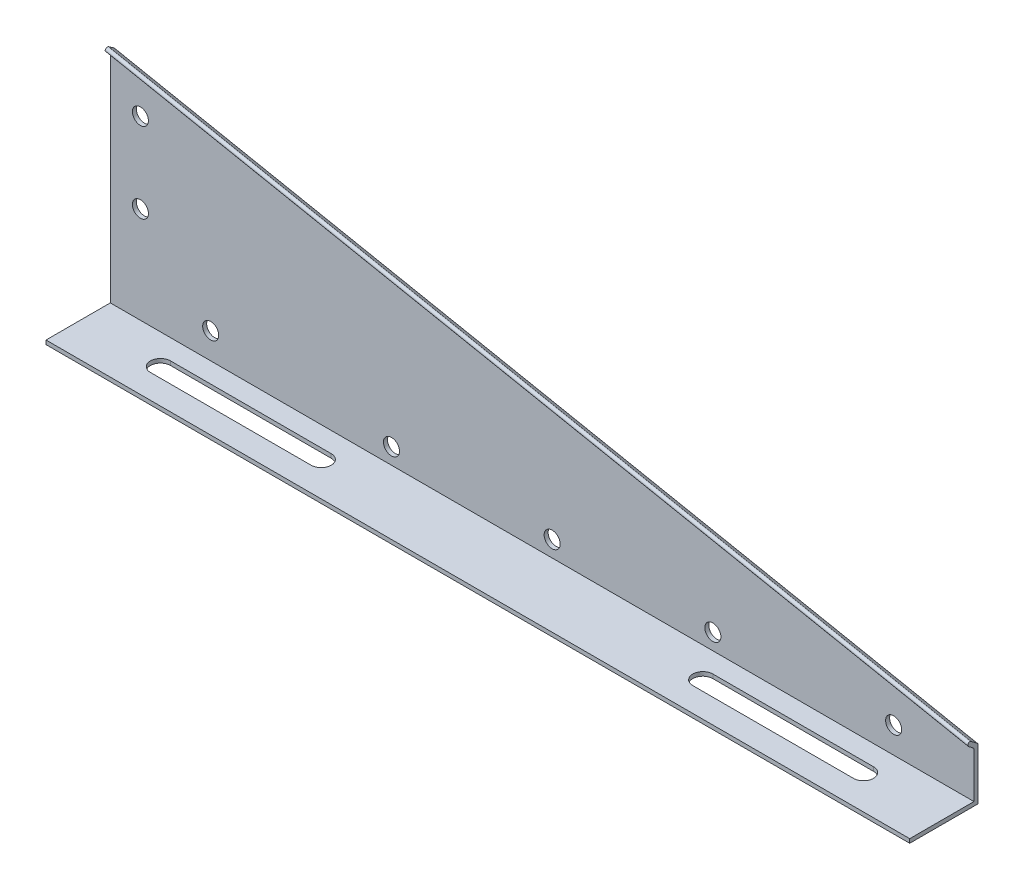
ISO-10303-21;
HEADER;
FILE_DESCRIPTION(('STEP AP214'),'2;1');
FILE_NAME('part.step','',(''),(''),'','','');
FILE_SCHEMA(('AUTOMOTIVE_DESIGN { 1 0 10303 214 1 1 1 1 }'));
ENDSEC;
DATA;
#1=APPLICATION_CONTEXT('core data for automotive mechanical design processes');
#2=APPLICATION_PROTOCOL_DEFINITION('international standard','automotive_design',2000,#1);
#3=PRODUCT_CONTEXT('',#1,'mechanical');
#4=PRODUCT('Part','Part','',(#3));
#5=PRODUCT_RELATED_PRODUCT_CATEGORY('part','',(#4));
#6=PRODUCT_DEFINITION_FORMATION('','',#4);
#7=PRODUCT_DEFINITION_CONTEXT('part definition',#1,'design');
#8=PRODUCT_DEFINITION('design','',#6,#7);
#9=PRODUCT_DEFINITION_SHAPE('','',#8);
#10=(LENGTH_UNIT() NAMED_UNIT(*) SI_UNIT(.MILLI.,.METRE.));
#11=(NAMED_UNIT(*) PLANE_ANGLE_UNIT() SI_UNIT($,.RADIAN.));
#12=(NAMED_UNIT(*) SI_UNIT($,.STERADIAN.) SOLID_ANGLE_UNIT());
#13=UNCERTAINTY_MEASURE_WITH_UNIT(LENGTH_MEASURE(1.E-05),#10,'distance_accuracy_value','');
#14=(GEOMETRIC_REPRESENTATION_CONTEXT(3) GLOBAL_UNCERTAINTY_ASSIGNED_CONTEXT((#13)) GLOBAL_UNIT_ASSIGNED_CONTEXT((#10,
#11,#12)) REPRESENTATION_CONTEXT('',''));
#15=CARTESIAN_POINT('',(0.,0.,0.));
#16=DIRECTION('',(0.,0.,1.));
#17=DIRECTION('',(1.,0.,0.));
#18=AXIS2_PLACEMENT_3D('',#15,#16,#17);
#19=CARTESIAN_POINT('',(0.,110.,2.));
#20=DIRECTION('',(1.,0.,0.));
#21=DIRECTION('',(0.,1.,0.));
#22=AXIS2_PLACEMENT_3D('',#19,#20,#21);
#23=PLANE('',#22);
#24=DIRECTION('',(0.,-1.,0.));
#25=VECTOR('',#24,1.);
#26=CARTESIAN_POINT('',(0.,110.,2.));
#27=LINE('',#26,#25);
#28=CARTESIAN_POINT('',(0.,2.,2.));
#29=VERTEX_POINT('',#28);
#30=CARTESIAN_POINT('',(0.,0.,2.));
#31=VERTEX_POINT('',#30);
#32=EDGE_CURVE('E187',#29,#31,#27,.T.);
#33=ORIENTED_EDGE('',*,*,#32,.F.);
#34=DIRECTION('',(0.,0.,1.));
#35=VECTOR('',#34,1.);
#36=CARTESIAN_POINT('',(0.,2.,-30.));
#37=LINE('',#36,#35);
#38=CARTESIAN_POINT('',(0.,2.,-30.));
#39=VERTEX_POINT('',#38);
#40=EDGE_CURVE('E49',#39,#29,#37,.T.);
#41=ORIENTED_EDGE('',*,*,#40,.F.);
#42=DIRECTION('',(0.,-1.,0.));
#43=VECTOR('',#42,1.);
#44=CARTESIAN_POINT('',(0.,110.,-30.));
#45=LINE('',#44,#43);
#46=CARTESIAN_POINT('',(0.,109.490324815257,-30.));
#47=VERTEX_POINT('',#46);
#48=EDGE_CURVE('E220',#47,#39,#45,.T.);
#49=ORIENTED_EDGE('',*,*,#48,.F.);
#50=CARTESIAN_POINT('',(0.,109.490324815257,-29.));
#51=DIRECTION('',(1.,0.,0.));
#52=DIRECTION('',(0.,1.,0.));
#53=AXIS2_PLACEMENT_3D('',#50,#51,#52);
#54=ELLIPSE('',#53,1.01935036948573,1.);
#55=CARTESIAN_POINT('',(0.,110.,-29.8660254037845));
#56=VERTEX_POINT('',#55);
#57=EDGE_CURVE('E206',#47,#56,#54,.T.);
#58=ORIENTED_EDGE('',*,*,#57,.T.);
#59=DIRECTION('',(0.,0.,1.));
#60=VECTOR('',#59,1.);
#61=CARTESIAN_POINT('',(0.,110.,-32.));
#62=LINE('',#61,#60);
#63=CARTESIAN_POINT('',(0.,110.,-32.));
#64=VERTEX_POINT('',#63);
#65=EDGE_CURVE('E57',#64,#56,#62,.T.);
#66=ORIENTED_EDGE('',*,*,#65,.F.);
#67=DIRECTION('',(0.,-1.,0.));
#68=VECTOR('',#67,1.);
#69=CARTESIAN_POINT('',(0.,110.,-32.));
#70=LINE('',#69,#68);
#71=CARTESIAN_POINT('',(0.,0.,-32.));
#72=VERTEX_POINT('',#71);
#73=EDGE_CURVE('E219',#64,#72,#70,.T.);
#74=ORIENTED_EDGE('',*,*,#73,.T.);
#75=DIRECTION('',(0.,0.,-1.));
#76=VECTOR('',#75,1.);
#77=CARTESIAN_POINT('',(0.,0.,2.));
#78=LINE('',#77,#76);
#79=EDGE_CURVE('E185',#31,#72,#78,.T.);
#80=ORIENTED_EDGE('',*,*,#79,.F.);
#81=EDGE_LOOP('',(#33,#41,#49,#58,#66,#74,#80));
#82=FACE_BOUND('',#81,.T.);
#83=ADVANCED_FACE('F35',(#82),#23,.F.);
#84=CARTESIAN_POINT('',(0.,0.,2.));
#85=DIRECTION('',(0.,1.,0.));
#86=DIRECTION('',(0.,0.,1.));
#87=AXIS2_PLACEMENT_3D('',#84,#85,#86);
#88=PLANE('',#87);
#89=DIRECTION('',(-1.,0.,0.));
#90=VECTOR('',#89,1.);
#91=CARTESIAN_POINT('',(0.,0.,-20.));
#92=LINE('',#91,#90);
#93=CARTESIAN_POINT('',(120.,0.,-20.));
#94=VERTEX_POINT('',#93);
#95=CARTESIAN_POINT('',(40.,0.,-20.));
#96=VERTEX_POINT('',#95);
#97=EDGE_CURVE('E293',#94,#96,#92,.T.);
#98=ORIENTED_EDGE('',*,*,#97,.T.);
#99=CARTESIAN_POINT('',(40.,0.,-15.));
#100=DIRECTION('',(0.,1.,0.));
#101=DIRECTION('',(0.,0.,1.));
#102=AXIS2_PLACEMENT_3D('',#99,#100,#101);
#103=CIRCLE('',#102,4.99999999999989);
#104=CARTESIAN_POINT('',(40.,0.,-10.0000000000002));
#105=VERTEX_POINT('',#104);
#106=EDGE_CURVE('E296',#96,#105,#103,.T.);
#107=ORIENTED_EDGE('',*,*,#106,.T.);
#108=DIRECTION('',(1.,0.,0.));
#109=VECTOR('',#108,1.);
#110=CARTESIAN_POINT('',(0.,0.,-10.0000000000003));
#111=LINE('',#110,#109);
#112=CARTESIAN_POINT('',(120.,0.,-10.0000000000001));
#113=VERTEX_POINT('',#112);
#114=EDGE_CURVE('E287',#105,#113,#111,.T.);
#115=ORIENTED_EDGE('',*,*,#114,.T.);
#116=CARTESIAN_POINT('',(120.,0.,-15.));
#117=DIRECTION('',(0.,1.,0.));
#118=DIRECTION('',(0.,0.,1.));
#119=AXIS2_PLACEMENT_3D('',#116,#117,#118);
#120=CIRCLE('',#119,4.99999999999993);
#121=EDGE_CURVE('E290',#113,#94,#120,.T.);
#122=ORIENTED_EDGE('',*,*,#121,.T.);
#123=EDGE_LOOP('',(#98,#107,#115,#122));
#124=FACE_BOUND('',#123,.T.);
#125=DIRECTION('',(1.,0.,0.));
#126=VECTOR('',#125,1.);
#127=CARTESIAN_POINT('',(0.,0.,-9.99999999999986));
#128=LINE('',#127,#126);
#129=CARTESIAN_POINT('',(310.,0.,-10.0000000000001));
#130=VERTEX_POINT('',#129);
#131=CARTESIAN_POINT('',(390.,0.,-10.0000000000002));
#132=VERTEX_POINT('',#131);
#133=EDGE_CURVE('E281',#130,#132,#128,.T.);
#134=ORIENTED_EDGE('',*,*,#133,.T.);
#135=CARTESIAN_POINT('',(390.,0.,-15.));
#136=DIRECTION('',(0.,1.,0.));
#137=DIRECTION('',(0.,0.,1.));
#138=AXIS2_PLACEMENT_3D('',#135,#136,#137);
#139=CIRCLE('',#138,4.99999999999989);
#140=CARTESIAN_POINT('',(390.,0.,-20.));
#141=VERTEX_POINT('',#140);
#142=EDGE_CURVE('E284',#132,#141,#139,.T.);
#143=ORIENTED_EDGE('',*,*,#142,.T.);
#144=DIRECTION('',(-1.,0.,0.));
#145=VECTOR('',#144,1.);
#146=CARTESIAN_POINT('',(0.,0.,-20.));
#147=LINE('',#146,#145);
#148=CARTESIAN_POINT('',(310.,0.,-20.));
#149=VERTEX_POINT('',#148);
#150=EDGE_CURVE('E251',#141,#149,#147,.T.);
#151=ORIENTED_EDGE('',*,*,#150,.T.);
#152=CARTESIAN_POINT('',(310.,0.,-15.));
#153=DIRECTION('',(0.,1.,0.));
#154=DIRECTION('',(0.,0.,1.));
#155=AXIS2_PLACEMENT_3D('',#152,#153,#154);
#156=CIRCLE('',#155,4.99999999999993);
#157=EDGE_CURVE('E278',#149,#130,#156,.T.);
#158=ORIENTED_EDGE('',*,*,#157,.T.);
#159=EDGE_LOOP('',(#134,#143,#151,#158));
#160=FACE_BOUND('',#159,.T.);
#161=ORIENTED_EDGE('',*,*,#79,.T.);
#162=DIRECTION('',(1.,0.,0.));
#163=VECTOR('',#162,1.);
#164=CARTESIAN_POINT('',(0.,0.,-32.));
#165=LINE('',#164,#163);
#166=CARTESIAN_POINT('',(430.,0.,-32.));
#167=VERTEX_POINT('',#166);
#168=EDGE_CURVE('E231',#72,#167,#165,.T.);
#169=ORIENTED_EDGE('',*,*,#168,.T.);
#170=DIRECTION('',(0.,0.,-1.));
#171=VECTOR('',#170,1.);
#172=CARTESIAN_POINT('',(430.,0.,2.));
#173=LINE('',#172,#171);
#174=CARTESIAN_POINT('',(430.,0.,2.));
#175=VERTEX_POINT('',#174);
#176=EDGE_CURVE('E183',#175,#167,#173,.T.);
#177=ORIENTED_EDGE('',*,*,#176,.F.);
#178=DIRECTION('',(1.,0.,0.));
#179=VECTOR('',#178,1.);
#180=CARTESIAN_POINT('',(0.,0.,2.));
#181=LINE('',#180,#179);
#182=EDGE_CURVE('E181',#31,#175,#181,.T.);
#183=ORIENTED_EDGE('',*,*,#182,.F.);
#184=EDGE_LOOP('',(#161,#169,#177,#183));
#185=FACE_BOUND('',#184,.T.);
#186=ADVANCED_FACE('F302',(#124,#160,#185),#88,.F.);
#187=CARTESIAN_POINT('',(430.,0.,2.));
#188=DIRECTION('',(-1.,0.,0.));
#189=DIRECTION('',(0.,0.,1.));
#190=AXIS2_PLACEMENT_3D('',#187,#188,#189);
#191=PLANE('',#190);
#192=DIRECTION('',(0.,0.,1.));
#193=VECTOR('',#192,1.);
#194=CARTESIAN_POINT('',(430.,2.,-30.));
#195=LINE('',#194,#193);
#196=CARTESIAN_POINT('',(430.,2.,-30.));
#197=VERTEX_POINT('',#196);
#198=CARTESIAN_POINT('',(430.,2.00000000000001,2.));
#199=VERTEX_POINT('',#198);
#200=EDGE_CURVE('E167',#197,#199,#195,.T.);
#201=ORIENTED_EDGE('',*,*,#200,.T.);
#202=DIRECTION('',(0.,1.,0.));
#203=VECTOR('',#202,1.);
#204=CARTESIAN_POINT('',(430.,0.,2.));
#205=LINE('',#204,#203);
#206=EDGE_CURVE('E170',#175,#199,#205,.T.);
#207=ORIENTED_EDGE('',*,*,#206,.F.);
#208=ORIENTED_EDGE('',*,*,#176,.T.);
#209=DIRECTION('',(0.,1.,0.));
#210=VECTOR('',#209,1.);
#211=CARTESIAN_POINT('',(430.,0.,-32.));
#212=LINE('',#211,#210);
#213=CARTESIAN_POINT('',(430.,25.5096751847429,-32.));
#214=VERTEX_POINT('',#213);
#215=EDGE_CURVE('E308',#167,#214,#212,.T.);
#216=ORIENTED_EDGE('',*,*,#215,.T.);
#217=CARTESIAN_POINT('',(430.,25.5096751847429,-31.));
#218=DIRECTION('',(-1.,0.,0.));
#219=DIRECTION('',(0.,1.,0.));
#220=AXIS2_PLACEMENT_3D('',#217,#218,#219);
#221=ELLIPSE('',#220,1.01935036948573,1.);
#222=CARTESIAN_POINT('',(430.,26.3251554803315,-31.6));
#223=VERTEX_POINT('',#222);
#224=EDGE_CURVE('E204',#214,#223,#221,.F.);
#225=ORIENTED_EDGE('',*,*,#224,.T.);
#226=DIRECTION('',(0.,0.607353301341572,0.794431851922803));
#227=VECTOR('',#226,1.);
#228=CARTESIAN_POINT('',(430.,25.5744944872024,-32.581881553324));
#229=LINE('',#228,#227);
#230=CARTESIAN_POINT('',(430.,28.6710385163511,-28.5315319426391));
#231=VERTEX_POINT('',#230);
#232=EDGE_CURVE('E226',#223,#231,#229,.T.);
#233=ORIENTED_EDGE('',*,*,#232,.T.);
#234=CARTESIAN_POINT('',(430.,27.8555582207625,-27.931531942639));
#235=DIRECTION('',(-1.,0.,0.));
#236=DIRECTION('',(0.,1.,0.));
#237=AXIS2_PLACEMENT_3D('',#234,#235,#236);
#238=ELLIPSE('',#237,1.01935036948573,1.00000000000001);
#239=CARTESIAN_POINT('',(430.,27.0400779251739,-27.331531942639));
#240=VERTEX_POINT('',#239);
#241=EDGE_CURVE('E228',#231,#240,#238,.F.);
#242=ORIENTED_EDGE('',*,*,#241,.T.);
#243=DIRECTION('',(0.,-0.607353301341573,-0.794431851922802));
#244=VECTOR('',#243,1.);
#245=CARTESIAN_POINT('',(430.,26.5810625857552,-27.9319343860766));
#246=LINE('',#245,#244);
#247=CARTESIAN_POINT('',(430.,25.3058051108457,-29.6));
#248=VERTEX_POINT('',#247);
#249=EDGE_CURVE('E212',#240,#248,#246,.T.);
#250=ORIENTED_EDGE('',*,*,#249,.T.);
#251=CARTESIAN_POINT('',(430.,24.4903248152572,-29.));
#252=DIRECTION('',(-1.,0.,0.));
#253=DIRECTION('',(0.,1.,0.));
#254=AXIS2_PLACEMENT_3D('',#251,#252,#253);
#255=ELLIPSE('',#254,1.01935036948573,1.);
#256=CARTESIAN_POINT('',(430.,24.4903248152572,-30.));
#257=VERTEX_POINT('',#256);
#258=EDGE_CURVE('E43',#248,#257,#255,.T.);
#259=ORIENTED_EDGE('',*,*,#258,.T.);
#260=DIRECTION('',(0.,1.,0.));
#261=VECTOR('',#260,1.);
#262=CARTESIAN_POINT('',(430.,0.,-30.));
#263=LINE('',#262,#261);
#264=EDGE_CURVE('E172',#197,#257,#263,.T.);
#265=ORIENTED_EDGE('',*,*,#264,.F.);
#266=EDGE_LOOP('',(#201,#207,#208,#216,#225,#233,#242,#250,#259,#265));
#267=FACE_BOUND('',#266,.T.);
#268=ADVANCED_FACE('F168',(#267),#191,.F.);
#269=CARTESIAN_POINT('',(0.,0.,2.));
#270=DIRECTION('',(0.,0.,1.));
#271=DIRECTION('',(1.,0.,0.));
#272=AXIS2_PLACEMENT_3D('',#269,#270,#271);
#273=PLANE('',#272);
#274=DIRECTION('',(1.,0.,0.));
#275=VECTOR('',#274,1.);
#276=CARTESIAN_POINT('',(0.,2.,2.));
#277=LINE('',#276,#275);
#278=EDGE_CURVE('E11',#29,#199,#277,.T.);
#279=ORIENTED_EDGE('',*,*,#278,.F.);
#280=ORIENTED_EDGE('',*,*,#32,.T.);
#281=ORIENTED_EDGE('',*,*,#182,.T.);
#282=ORIENTED_EDGE('',*,*,#206,.T.);
#283=EDGE_LOOP('',(#279,#280,#281,#282));
#284=FACE_BOUND('',#283,.T.);
#285=ADVANCED_FACE('F179',(#284),#273,.T.);
#286=CARTESIAN_POINT('',(430.,2.,-30.));
#287=DIRECTION('',(0.,-1.,0.));
#288=DIRECTION('',(1.,0.,0.));
#289=AXIS2_PLACEMENT_3D('',#286,#287,#288);
#290=PLANE('',#289);
#291=DIRECTION('',(1.,0.,0.));
#292=VECTOR('',#291,1.);
#293=CARTESIAN_POINT('',(40.,2.,-10.0000000000002));
#294=LINE('',#293,#292);
#295=CARTESIAN_POINT('',(39.9999999999999,2.,-10.0000000000002));
#296=VERTEX_POINT('',#295);
#297=CARTESIAN_POINT('',(120.,2.,-10.0000000000001));
#298=VERTEX_POINT('',#297);
#299=EDGE_CURVE('E238',#296,#298,#294,.T.);
#300=ORIENTED_EDGE('',*,*,#299,.F.);
#301=CARTESIAN_POINT('',(40.,2.,-15.));
#302=DIRECTION('',(0.,1.,0.));
#303=DIRECTION('',(-1.,0.,0.));
#304=AXIS2_PLACEMENT_3D('',#301,#302,#303);
#305=CIRCLE('',#304,4.99999999999989);
#306=CARTESIAN_POINT('',(40.,2.,-20.));
#307=VERTEX_POINT('',#306);
#308=EDGE_CURVE('E236',#307,#296,#305,.T.);
#309=ORIENTED_EDGE('',*,*,#308,.F.);
#310=DIRECTION('',(-1.,0.,0.));
#311=VECTOR('',#310,1.);
#312=CARTESIAN_POINT('',(40.,2.,-20.));
#313=LINE('',#312,#311);
#314=CARTESIAN_POINT('',(120.,2.,-20.));
#315=VERTEX_POINT('',#314);
#316=EDGE_CURVE('E245',#315,#307,#313,.T.);
#317=ORIENTED_EDGE('',*,*,#316,.F.);
#318=CARTESIAN_POINT('',(120.,2.,-15.));
#319=DIRECTION('',(0.,1.,0.));
#320=DIRECTION('',(-1.,0.,0.));
#321=AXIS2_PLACEMENT_3D('',#318,#319,#320);
#322=CIRCLE('',#321,4.99999999999993);
#323=EDGE_CURVE('E242',#298,#315,#322,.T.);
#324=ORIENTED_EDGE('',*,*,#323,.F.);
#325=EDGE_LOOP('',(#300,#309,#317,#324));
#326=FACE_BOUND('',#325,.T.);
#327=DIRECTION('',(-1.,0.,0.));
#328=VECTOR('',#327,1.);
#329=CARTESIAN_POINT('',(390.,2.,-20.));
#330=LINE('',#329,#328);
#331=CARTESIAN_POINT('',(390.,2.,-20.));
#332=VERTEX_POINT('',#331);
#333=CARTESIAN_POINT('',(310.,2.,-20.));
#334=VERTEX_POINT('',#333);
#335=EDGE_CURVE('E259',#332,#334,#330,.T.);
#336=ORIENTED_EDGE('',*,*,#335,.F.);
#337=CARTESIAN_POINT('',(390.,2.,-15.));
#338=DIRECTION('',(0.,1.,0.));
#339=DIRECTION('',(1.,0.,0.));
#340=AXIS2_PLACEMENT_3D('',#337,#338,#339);
#341=CIRCLE('',#340,4.99999999999989);
#342=CARTESIAN_POINT('',(390.,2.,-10.0000000000002));
#343=VERTEX_POINT('',#342);
#344=EDGE_CURVE('E235',#343,#332,#341,.T.);
#345=ORIENTED_EDGE('',*,*,#344,.F.);
#346=DIRECTION('',(1.,0.,0.));
#347=VECTOR('',#346,1.);
#348=CARTESIAN_POINT('',(390.,2.,-10.0000000000002));
#349=LINE('',#348,#347);
#350=CARTESIAN_POINT('',(310.,2.,-10.0000000000001));
#351=VERTEX_POINT('',#350);
#352=EDGE_CURVE('E265',#351,#343,#349,.T.);
#353=ORIENTED_EDGE('',*,*,#352,.F.);
#354=CARTESIAN_POINT('',(310.,2.,-15.));
#355=DIRECTION('',(0.,1.,0.));
#356=DIRECTION('',(1.,0.,0.));
#357=AXIS2_PLACEMENT_3D('',#354,#355,#356);
#358=CIRCLE('',#357,4.99999999999993);
#359=EDGE_CURVE('E262',#334,#351,#358,.T.);
#360=ORIENTED_EDGE('',*,*,#359,.F.);
#361=EDGE_LOOP('',(#336,#345,#353,#360));
#362=FACE_BOUND('',#361,.T.);
#363=ORIENTED_EDGE('',*,*,#40,.T.);
#364=ORIENTED_EDGE('',*,*,#278,.T.);
#365=ORIENTED_EDGE('',*,*,#200,.F.);
#366=DIRECTION('',(1.,0.,0.));
#367=VECTOR('',#366,1.);
#368=CARTESIAN_POINT('',(430.,2.,-30.));
#369=LINE('',#368,#367);
#370=EDGE_CURVE('E174',#39,#197,#369,.T.);
#371=ORIENTED_EDGE('',*,*,#370,.F.);
#372=EDGE_LOOP('',(#363,#364,#365,#371));
#373=FACE_BOUND('',#372,.T.);
#374=ADVANCED_FACE('F176',(#326,#362,#373),#290,.F.);
#375=CARTESIAN_POINT('',(390.,-48.,-15.));
#376=DIRECTION('',(0.,1.,0.));
#377=DIRECTION('',(-1.,0.,0.));
#378=AXIS2_PLACEMENT_3D('',#375,#376,#377);
#379=CYLINDRICAL_SURFACE('',#378,4.99999999999989);
#380=DIRECTION('',(0.,1.,0.));
#381=VECTOR('',#380,1.);
#382=CARTESIAN_POINT('',(390.,-48.,-10.0000000000002));
#383=LINE('',#382,#381);
#384=EDGE_CURVE('E239',#132,#343,#383,.T.);
#385=ORIENTED_EDGE('',*,*,#384,.T.);
#386=ORIENTED_EDGE('',*,*,#344,.T.);
#387=DIRECTION('',(0.,1.,0.));
#388=VECTOR('',#387,1.);
#389=CARTESIAN_POINT('',(390.,-48.,-20.));
#390=LINE('',#389,#388);
#391=EDGE_CURVE('E268',#141,#332,#390,.T.);
#392=ORIENTED_EDGE('',*,*,#391,.F.);
#393=ORIENTED_EDGE('',*,*,#142,.F.);
#394=EDGE_LOOP('',(#385,#386,#392,#393));
#395=FACE_BOUND('',#394,.T.);
#396=ADVANCED_FACE('F466',(#395),#379,.F.);
#397=CARTESIAN_POINT('',(390.,-48.,-10.0000000000002));
#398=DIRECTION('',(0.,0.,1.));
#399=DIRECTION('',(1.,0.,0.));
#400=AXIS2_PLACEMENT_3D('',#397,#398,#399);
#401=PLANE('',#400);
#402=DIRECTION('',(0.,1.,0.));
#403=VECTOR('',#402,1.);
#404=CARTESIAN_POINT('',(310.,-48.,-10.0000000000001));
#405=LINE('',#404,#403);
#406=EDGE_CURVE('E270',#130,#351,#405,.T.);
#407=ORIENTED_EDGE('',*,*,#406,.T.);
#408=ORIENTED_EDGE('',*,*,#352,.T.);
#409=ORIENTED_EDGE('',*,*,#384,.F.);
#410=ORIENTED_EDGE('',*,*,#133,.F.);
#411=EDGE_LOOP('',(#407,#408,#409,#410));
#412=FACE_BOUND('',#411,.T.);
#413=ADVANCED_FACE('F462',(#412),#401,.F.);
#414=CARTESIAN_POINT('',(310.,-48.,-15.));
#415=DIRECTION('',(0.,1.,0.));
#416=DIRECTION('',(-1.,0.,0.));
#417=AXIS2_PLACEMENT_3D('',#414,#415,#416);
#418=CYLINDRICAL_SURFACE('',#417,4.99999999999993);
#419=DIRECTION('',(0.,1.,0.));
#420=VECTOR('',#419,1.);
#421=CARTESIAN_POINT('',(310.,-48.,-20.));
#422=LINE('',#421,#420);
#423=EDGE_CURVE('E272',#149,#334,#422,.T.);
#424=ORIENTED_EDGE('',*,*,#423,.T.);
#425=ORIENTED_EDGE('',*,*,#359,.T.);
#426=ORIENTED_EDGE('',*,*,#406,.F.);
#427=ORIENTED_EDGE('',*,*,#157,.F.);
#428=EDGE_LOOP('',(#424,#425,#426,#427));
#429=FACE_BOUND('',#428,.T.);
#430=ADVANCED_FACE('F465',(#429),#418,.F.);
#431=CARTESIAN_POINT('',(390.,-48.,-20.));
#432=DIRECTION('',(0.,0.,-1.));
#433=DIRECTION('',(-1.,0.,0.));
#434=AXIS2_PLACEMENT_3D('',#431,#432,#433);
#435=PLANE('',#434);
#436=ORIENTED_EDGE('',*,*,#391,.T.);
#437=ORIENTED_EDGE('',*,*,#335,.T.);
#438=ORIENTED_EDGE('',*,*,#423,.F.);
#439=ORIENTED_EDGE('',*,*,#150,.F.);
#440=EDGE_LOOP('',(#436,#437,#438,#439));
#441=FACE_BOUND('',#440,.T.);
#442=ADVANCED_FACE('F460',(#441),#435,.F.);
#443=CARTESIAN_POINT('',(40.,-48.,-15.));
#444=DIRECTION('',(0.,1.,0.));
#445=DIRECTION('',(-1.,0.,0.));
#446=AXIS2_PLACEMENT_3D('',#443,#444,#445);
#447=CYLINDRICAL_SURFACE('',#446,4.99999999999989);
#448=DIRECTION('',(0.,1.,0.));
#449=VECTOR('',#448,1.);
#450=CARTESIAN_POINT('',(40.,-48.,-20.));
#451=LINE('',#450,#449);
#452=EDGE_CURVE('E249',#96,#307,#451,.T.);
#453=ORIENTED_EDGE('',*,*,#452,.T.);
#454=ORIENTED_EDGE('',*,*,#308,.T.);
#455=DIRECTION('',(0.,1.,0.));
#456=VECTOR('',#455,1.);
#457=CARTESIAN_POINT('',(40.,-48.,-10.0000000000002));
#458=LINE('',#457,#456);
#459=EDGE_CURVE('E248',#105,#296,#458,.T.);
#460=ORIENTED_EDGE('',*,*,#459,.F.);
#461=ORIENTED_EDGE('',*,*,#106,.F.);
#462=EDGE_LOOP('',(#453,#454,#460,#461));
#463=FACE_BOUND('',#462,.T.);
#464=ADVANCED_FACE('F450',(#463),#447,.F.);
#465=CARTESIAN_POINT('',(40.,-48.,-20.));
#466=DIRECTION('',(0.,0.,-1.));
#467=DIRECTION('',(-1.,0.,0.));
#468=AXIS2_PLACEMENT_3D('',#465,#466,#467);
#469=PLANE('',#468);
#470=DIRECTION('',(0.,1.,0.));
#471=VECTOR('',#470,1.);
#472=CARTESIAN_POINT('',(120.,-48.,-20.));
#473=LINE('',#472,#471);
#474=EDGE_CURVE('E252',#94,#315,#473,.T.);
#475=ORIENTED_EDGE('',*,*,#474,.T.);
#476=ORIENTED_EDGE('',*,*,#316,.T.);
#477=ORIENTED_EDGE('',*,*,#452,.F.);
#478=ORIENTED_EDGE('',*,*,#97,.F.);
#479=EDGE_LOOP('',(#475,#476,#477,#478));
#480=FACE_BOUND('',#479,.T.);
#481=ADVANCED_FACE('F446',(#480),#469,.F.);
#482=CARTESIAN_POINT('',(120.,-48.,-15.));
#483=DIRECTION('',(0.,1.,0.));
#484=DIRECTION('',(-1.,0.,0.));
#485=AXIS2_PLACEMENT_3D('',#482,#483,#484);
#486=CYLINDRICAL_SURFACE('',#485,4.99999999999993);
#487=DIRECTION('',(0.,1.,0.));
#488=VECTOR('',#487,1.);
#489=CARTESIAN_POINT('',(120.,-48.,-10.0000000000001));
#490=LINE('',#489,#488);
#491=EDGE_CURVE('E254',#113,#298,#490,.T.);
#492=ORIENTED_EDGE('',*,*,#491,.T.);
#493=ORIENTED_EDGE('',*,*,#323,.T.);
#494=ORIENTED_EDGE('',*,*,#474,.F.);
#495=ORIENTED_EDGE('',*,*,#121,.F.);
#496=EDGE_LOOP('',(#492,#493,#494,#495));
#497=FACE_BOUND('',#496,.T.);
#498=ADVANCED_FACE('F449',(#497),#486,.F.);
#499=CARTESIAN_POINT('',(40.,-48.,-10.0000000000002));
#500=DIRECTION('',(0.,0.,1.));
#501=DIRECTION('',(1.,0.,0.));
#502=AXIS2_PLACEMENT_3D('',#499,#500,#501);
#503=PLANE('',#502);
#504=ORIENTED_EDGE('',*,*,#459,.T.);
#505=ORIENTED_EDGE('',*,*,#299,.T.);
#506=ORIENTED_EDGE('',*,*,#491,.F.);
#507=ORIENTED_EDGE('',*,*,#114,.F.);
#508=EDGE_LOOP('',(#504,#505,#506,#507));
#509=FACE_BOUND('',#508,.T.);
#510=ADVANCED_FACE('F386',(#509),#503,.F.);
#511=CARTESIAN_POINT('',(0.,0.,-30.));
#512=DIRECTION('',(0.,0.,-1.));
#513=DIRECTION('',(1.,0.,0.));
#514=AXIS2_PLACEMENT_3D('',#511,#512,#513);
#515=PLANE('',#514);
#516=CARTESIAN_POINT('',(140.,10.,-30.));
#517=DIRECTION('',(0.,0.,-1.));
#518=DIRECTION('',(-1.,0.,0.));
#519=AXIS2_PLACEMENT_3D('',#516,#517,#518);
#520=CIRCLE('',#519,3.99999999999999);
#521=CARTESIAN_POINT('',(136.,10.,-30.));
#522=VERTEX_POINT('',#521);
#523=EDGE_CURVE('E352',#522,#522,#520,.F.);
#524=ORIENTED_EDGE('',*,*,#523,.F.);
#525=EDGE_LOOP('',(#524));
#526=FACE_BOUND('',#525,.T.);
#527=CARTESIAN_POINT('',(220.,10.,-30.));
#528=DIRECTION('',(0.,0.,-1.));
#529=DIRECTION('',(-1.,0.,0.));
#530=AXIS2_PLACEMENT_3D('',#527,#528,#529);
#531=CIRCLE('',#530,3.99999999999999);
#532=CARTESIAN_POINT('',(216.,10.,-30.));
#533=VERTEX_POINT('',#532);
#534=EDGE_CURVE('E359',#533,#533,#531,.F.);
#535=ORIENTED_EDGE('',*,*,#534,.F.);
#536=EDGE_LOOP('',(#535));
#537=FACE_BOUND('',#536,.T.);
#538=CARTESIAN_POINT('',(300.,10.,-30.));
#539=DIRECTION('',(0.,0.,-1.));
#540=DIRECTION('',(-1.,0.,0.));
#541=AXIS2_PLACEMENT_3D('',#538,#539,#540);
#542=CIRCLE('',#541,3.99999999999999);
#543=CARTESIAN_POINT('',(296.,10.,-30.));
#544=VERTEX_POINT('',#543);
#545=EDGE_CURVE('E362',#544,#544,#542,.F.);
#546=ORIENTED_EDGE('',*,*,#545,.F.);
#547=EDGE_LOOP('',(#546));
#548=FACE_BOUND('',#547,.T.);
#549=CARTESIAN_POINT('',(15.,90.,-30.));
#550=DIRECTION('',(0.,0.,-1.));
#551=DIRECTION('',(-1.,0.,0.));
#552=AXIS2_PLACEMENT_3D('',#549,#550,#551);
#553=CIRCLE('',#552,4.);
#554=CARTESIAN_POINT('',(11.,90.,-30.));
#555=VERTEX_POINT('',#554);
#556=EDGE_CURVE('E329',#555,#555,#553,.F.);
#557=ORIENTED_EDGE('',*,*,#556,.F.);
#558=EDGE_LOOP('',(#557));
#559=FACE_BOUND('',#558,.T.);
#560=CARTESIAN_POINT('',(390.,15.,-30.));
#561=DIRECTION('',(0.,0.,-1.));
#562=DIRECTION('',(-1.,0.,0.));
#563=AXIS2_PLACEMENT_3D('',#560,#561,#562);
#564=CIRCLE('',#563,3.99999999999999);
#565=CARTESIAN_POINT('',(386.,15.,-30.));
#566=VERTEX_POINT('',#565);
#567=EDGE_CURVE('E335',#566,#566,#564,.F.);
#568=ORIENTED_EDGE('',*,*,#567,.F.);
#569=EDGE_LOOP('',(#568));
#570=FACE_BOUND('',#569,.T.);
#571=CARTESIAN_POINT('',(50.,15.,-30.));
#572=DIRECTION('',(0.,0.,-1.));
#573=DIRECTION('',(-1.,0.,0.));
#574=AXIS2_PLACEMENT_3D('',#571,#572,#573);
#575=CIRCLE('',#574,4.00000000000001);
#576=CARTESIAN_POINT('',(46.,15.,-30.));
#577=VERTEX_POINT('',#576);
#578=EDGE_CURVE('E338',#577,#577,#575,.F.);
#579=ORIENTED_EDGE('',*,*,#578,.F.);
#580=EDGE_LOOP('',(#579));
#581=FACE_BOUND('',#580,.T.);
#582=CARTESIAN_POINT('',(15.,50.,-30.));
#583=DIRECTION('',(0.,0.,-1.));
#584=DIRECTION('',(-1.,0.,0.));
#585=AXIS2_PLACEMENT_3D('',#582,#583,#584);
#586=CIRCLE('',#585,4.00000000000001);
#587=CARTESIAN_POINT('',(11.,50.,-30.));
#588=VERTEX_POINT('',#587);
#589=EDGE_CURVE('E341',#588,#588,#586,.F.);
#590=ORIENTED_EDGE('',*,*,#589,.F.);
#591=EDGE_LOOP('',(#590));
#592=FACE_BOUND('',#591,.T.);
#593=ORIENTED_EDGE('',*,*,#264,.T.);
#594=DIRECTION('',(-0.981016959364532,0.193921957083687,0.));
#595=VECTOR('',#594,1.);
#596=CARTESIAN_POINT('',(20.8295191776065,105.372861722009,-30.));
#597=LINE('',#596,#595);
#598=EDGE_CURVE('E192',#257,#47,#597,.T.);
#599=ORIENTED_EDGE('',*,*,#598,.T.);
#600=ORIENTED_EDGE('',*,*,#48,.T.);
#601=ORIENTED_EDGE('',*,*,#370,.T.);
#602=EDGE_LOOP('',(#593,#599,#600,#601));
#603=FACE_BOUND('',#602,.T.);
#604=ADVANCED_FACE('F217',(#526,#537,#548,#559,#570,#581,#592,#603),#515,.F.);
#605=CARTESIAN_POINT('',(0.,0.,-32.));
#606=DIRECTION('',(0.,0.,-1.));
#607=DIRECTION('',(1.,0.,0.));
#608=AXIS2_PLACEMENT_3D('',#605,#606,#607);
#609=PLANE('',#608);
#610=CARTESIAN_POINT('',(140.,10.,-32.));
#611=DIRECTION('',(0.,0.,1.));
#612=DIRECTION('',(1.,0.,0.));
#613=AXIS2_PLACEMENT_3D('',#610,#611,#612);
#614=CIRCLE('',#613,3.99999999999999);
#615=CARTESIAN_POINT('',(144.,10.,-32.));
#616=VERTEX_POINT('',#615);
#617=EDGE_CURVE('E365',#616,#616,#614,.T.);
#618=ORIENTED_EDGE('',*,*,#617,.T.);
#619=EDGE_LOOP('',(#618));
#620=FACE_BOUND('',#619,.T.);
#621=CARTESIAN_POINT('',(220.,10.,-32.));
#622=DIRECTION('',(0.,0.,1.));
#623=DIRECTION('',(1.,0.,0.));
#624=AXIS2_PLACEMENT_3D('',#621,#622,#623);
#625=CIRCLE('',#624,3.99999999999999);
#626=CARTESIAN_POINT('',(224.,10.,-32.));
#627=VERTEX_POINT('',#626);
#628=EDGE_CURVE('E369',#627,#627,#625,.T.);
#629=ORIENTED_EDGE('',*,*,#628,.T.);
#630=EDGE_LOOP('',(#629));
#631=FACE_BOUND('',#630,.T.);
#632=CARTESIAN_POINT('',(300.,10.,-32.));
#633=DIRECTION('',(0.,0.,1.));
#634=DIRECTION('',(1.,0.,0.));
#635=AXIS2_PLACEMENT_3D('',#632,#633,#634);
#636=CIRCLE('',#635,3.99999999999999);
#637=CARTESIAN_POINT('',(304.,10.,-32.));
#638=VERTEX_POINT('',#637);
#639=EDGE_CURVE('E366',#638,#638,#636,.T.);
#640=ORIENTED_EDGE('',*,*,#639,.T.);
#641=EDGE_LOOP('',(#640));
#642=FACE_BOUND('',#641,.T.);
#643=CARTESIAN_POINT('',(15.,90.,-32.));
#644=DIRECTION('',(0.,0.,1.));
#645=DIRECTION('',(1.,0.,0.));
#646=AXIS2_PLACEMENT_3D('',#643,#644,#645);
#647=CIRCLE('',#646,4.);
#648=CARTESIAN_POINT('',(19.,90.,-32.));
#649=VERTEX_POINT('',#648);
#650=EDGE_CURVE('E348',#649,#649,#647,.T.);
#651=ORIENTED_EDGE('',*,*,#650,.T.);
#652=EDGE_LOOP('',(#651));
#653=FACE_BOUND('',#652,.T.);
#654=CARTESIAN_POINT('',(390.,15.,-32.));
#655=DIRECTION('',(0.,0.,1.));
#656=DIRECTION('',(1.,0.,0.));
#657=AXIS2_PLACEMENT_3D('',#654,#655,#656);
#658=CIRCLE('',#657,3.99999999999999);
#659=CARTESIAN_POINT('',(394.,15.,-32.));
#660=VERTEX_POINT('',#659);
#661=EDGE_CURVE('E351',#660,#660,#658,.T.);
#662=ORIENTED_EDGE('',*,*,#661,.T.);
#663=EDGE_LOOP('',(#662));
#664=FACE_BOUND('',#663,.T.);
#665=CARTESIAN_POINT('',(50.,15.,-32.));
#666=DIRECTION('',(0.,0.,1.));
#667=DIRECTION('',(1.,0.,0.));
#668=AXIS2_PLACEMENT_3D('',#665,#666,#667);
#669=CIRCLE('',#668,4.00000000000001);
#670=CARTESIAN_POINT('',(54.,15.,-32.));
#671=VERTEX_POINT('',#670);
#672=EDGE_CURVE('E347',#671,#671,#669,.T.);
#673=ORIENTED_EDGE('',*,*,#672,.T.);
#674=EDGE_LOOP('',(#673));
#675=FACE_BOUND('',#674,.T.);
#676=CARTESIAN_POINT('',(15.,50.,-32.));
#677=DIRECTION('',(0.,0.,1.));
#678=DIRECTION('',(1.,0.,0.));
#679=AXIS2_PLACEMENT_3D('',#676,#677,#678);
#680=CIRCLE('',#679,4.00000000000001);
#681=CARTESIAN_POINT('',(19.,50.,-32.));
#682=VERTEX_POINT('',#681);
#683=EDGE_CURVE('E344',#682,#682,#680,.T.);
#684=ORIENTED_EDGE('',*,*,#683,.T.);
#685=EDGE_LOOP('',(#684));
#686=FACE_BOUND('',#685,.T.);
#687=DIRECTION('',(-0.193921957083689,-0.981016959364532,0.));
#688=VECTOR('',#687,1.);
#689=CARTESIAN_POINT('',(0.,110.,-32.));
#690=LINE('',#689,#688);
#691=CARTESIAN_POINT('',(0.0969609785418476,110.490508479682,-32.));
#692=VERTEX_POINT('',#691);
#693=EDGE_CURVE('E328',#692,#64,#690,.T.);
#694=ORIENTED_EDGE('',*,*,#693,.F.);
#695=DIRECTION('',(-0.981016959364533,0.193921957083687,0.));
#696=VECTOR('',#695,1.);
#697=CARTESIAN_POINT('',(21.0234411346902,106.353878681374,-32.));
#698=LINE('',#697,#696);
#699=EDGE_CURVE('E202',#692,#214,#698,.F.);
#700=ORIENTED_EDGE('',*,*,#699,.T.);
#701=ORIENTED_EDGE('',*,*,#215,.F.);
#702=ORIENTED_EDGE('',*,*,#168,.F.);
#703=ORIENTED_EDGE('',*,*,#73,.F.);
#704=EDGE_LOOP('',(#694,#700,#701,#702,#703));
#705=FACE_BOUND('',#704,.T.);
#706=ADVANCED_FACE('F311',(#620,#631,#642,#653,#664,#675,#686,#705),#609,.T.);
#707=CARTESIAN_POINT('',(436.10078997744,24.8133802576662,-32.));
#708=DIRECTION('',(0.155137565666948,0.784813567491618,-0.600000000000012));
#709=DIRECTION('',(0.,0.607353301341572,0.794431851922803));
#710=AXIS2_PLACEMENT_3D('',#707,#708,#709);
#711=PLANE('',#710);
#712=ORIENTED_EDGE('',*,*,#232,.F.);
#713=DIRECTION('',(-0.981016959364533,0.193921957083687,0.));
#714=VECTOR('',#713,1.);
#715=CARTESIAN_POINT('',(436.158966564565,25.1076853454756,-31.6));
#716=LINE('',#715,#714);
#717=CARTESIAN_POINT('',(0.252098544208797,111.275322047174,-31.6));
#718=VERTEX_POINT('',#717);
#719=EDGE_CURVE('E197',#223,#718,#716,.T.);
#720=ORIENTED_EDGE('',*,*,#719,.T.);
#721=DIRECTION('',(-0.116353174250214,-0.588610175618731,-0.799999999999991));
#722=VECTOR('',#721,1.);
#723=CARTESIAN_POINT('',(0.19392195708369,110.981016959365,-32.));
#724=LINE('',#723,#722);
#725=CARTESIAN_POINT('',(0.698381042407969,113.532986449829,-28.5315319426391));
#726=VERTEX_POINT('',#725);
#727=EDGE_CURVE('E325',#726,#718,#724,.T.);
#728=ORIENTED_EDGE('',*,*,#727,.F.);
#729=DIRECTION('',(-0.981016959364533,0.193921957083687,0.));
#730=VECTOR('',#729,1.);
#731=CARTESIAN_POINT('',(436.605249062764,27.3653497481302,-28.5315319426391));
#732=LINE('',#731,#730);
#733=EDGE_CURVE('E315',#231,#726,#732,.T.);
#734=ORIENTED_EDGE('',*,*,#733,.F.);
#735=EDGE_LOOP('',(#712,#720,#728,#734));
#736=FACE_BOUND('',#735,.T.);
#737=ADVANCED_FACE('F439',(#736),#711,.T.);
#738=CARTESIAN_POINT('',(436.450111497097,26.5805361806386,-27.931531942639));
#739=DIRECTION('',(-0.981016959364533,0.193921957083687,0.));
#740=DIRECTION('',(-0.193921957083687,-0.981016959364533,0.));
#741=AXIS2_PLACEMENT_3D('',#738,#739,#740);
#742=CYLINDRICAL_SURFACE('',#741,1.00000000000001);
#743=ORIENTED_EDGE('',*,*,#241,.F.);
#744=ORIENTED_EDGE('',*,*,#733,.T.);
#745=CARTESIAN_POINT('',(0.54324347674102,112.748172882337,-27.931531942639));
#746=DIRECTION('',(-0.981016959364532,0.193921957083687,0.));
#747=DIRECTION('',(-0.193921957083687,-0.981016959364532,0.));
#748=AXIS2_PLACEMENT_3D('',#745,#746,#747);
#749=CIRCLE('',#748,1.00000000000001);
#750=CARTESIAN_POINT('',(0.38810591107407,111.963359314845,-27.331531942639));
#751=VERTEX_POINT('',#750);
#752=EDGE_CURVE('E322',#751,#726,#749,.T.);
#753=ORIENTED_EDGE('',*,*,#752,.F.);
#754=DIRECTION('',(-0.981016959364533,0.193921957083687,0.));
#755=VECTOR('',#754,1.);
#756=CARTESIAN_POINT('',(436.29497393143,25.795722613147,-27.331531942639));
#757=LINE('',#756,#755);
#758=EDGE_CURVE('E317',#240,#751,#757,.T.);
#759=ORIENTED_EDGE('',*,*,#758,.F.);
#760=EDGE_LOOP('',(#743,#744,#753,#759));
#761=FACE_BOUND('',#760,.T.);
#762=ADVANCED_FACE('F433',(#761),#742,.T.);
#763=CARTESIAN_POINT('',(436.29497393143,25.795722613147,-27.331531942639));
#764=DIRECTION('',(-0.155137565666948,-0.784813567491617,0.600000000000012));
#765=DIRECTION('',(0.,-0.607353301341573,-0.794431851922802));
#766=AXIS2_PLACEMENT_3D('',#763,#764,#765);
#767=PLANE('',#766);
#768=DIRECTION('',(0.116353174250215,0.588610175618732,0.799999999999991));
#769=VECTOR('',#768,1.);
#770=CARTESIAN_POINT('',(0.38810591107407,111.963359314845,-27.331531942639));
#771=LINE('',#770,#769);
#772=CARTESIAN_POINT('',(0.0581765871251068,110.294305087809,-29.6));
#773=VERTEX_POINT('',#772);
#774=EDGE_CURVE('E320',#773,#751,#771,.T.);
#775=ORIENTED_EDGE('',*,*,#774,.F.);
#776=DIRECTION('',(-0.981016959364532,0.193921957083687,0.));
#777=VECTOR('',#776,1.);
#778=CARTESIAN_POINT('',(435.965044607481,24.1266683861111,-29.6));
#779=LINE('',#778,#777);
#780=EDGE_CURVE('E195',#773,#248,#779,.F.);
#781=ORIENTED_EDGE('',*,*,#780,.T.);
#782=ORIENTED_EDGE('',*,*,#249,.F.);
#783=ORIENTED_EDGE('',*,*,#758,.T.);
#784=EDGE_LOOP('',(#775,#781,#782,#783));
#785=FACE_BOUND('',#784,.T.);
#786=ADVANCED_FACE('F429',(#785),#767,.T.);
#787=CARTESIAN_POINT('',(0.54324347674102,112.748172882337,-27.931531942639));
#788=DIRECTION('',(-0.981016959364532,0.193921957083687,0.));
#789=DIRECTION('',(-0.193921957083687,-0.981016959364532,0.));
#790=AXIS2_PLACEMENT_3D('',#787,#788,#789);
#791=PLANE('',#790);
#792=ORIENTED_EDGE('',*,*,#727,.T.);
#793=CARTESIAN_POINT('',(0.0969609785418379,110.490508479682,-31.));
#794=DIRECTION('',(-0.981016959364532,0.193921957083687,0.));
#795=DIRECTION('',(-0.193921957083687,-0.981016959364532,0.));
#796=AXIS2_PLACEMENT_3D('',#793,#794,#795);
#797=CIRCLE('',#796,1.);
#798=EDGE_CURVE('E200',#718,#692,#797,.T.);
#799=ORIENTED_EDGE('',*,*,#798,.T.);
#800=ORIENTED_EDGE('',*,*,#693,.T.);
#801=ORIENTED_EDGE('',*,*,#65,.T.);
#802=CARTESIAN_POINT('',(-0.0969609785418379,109.509491520318,-29.));
#803=DIRECTION('',(-0.981016959364532,0.193921957083687,0.));
#804=DIRECTION('',(-0.193921957083687,-0.981016959364532,0.));
#805=AXIS2_PLACEMENT_3D('',#802,#803,#804);
#806=CIRCLE('',#805,1.);
#807=EDGE_CURVE('E208',#56,#773,#806,.F.);
#808=ORIENTED_EDGE('',*,*,#807,.T.);
#809=ORIENTED_EDGE('',*,*,#774,.T.);
#810=ORIENTED_EDGE('',*,*,#752,.T.);
#811=EDGE_LOOP('',(#792,#799,#800,#801,#808,#809,#810));
#812=FACE_BOUND('',#811,.T.);
#813=ADVANCED_FACE('F425',(#812),#791,.T.);
#814=CARTESIAN_POINT('',(20.8295191776065,105.372861722009,-29.));
#815=DIRECTION('',(-0.981016959364532,0.193921957083687,0.));
#816=DIRECTION('',(-0.193921957083687,-0.981016959364532,0.));
#817=AXIS2_PLACEMENT_3D('',#814,#815,#816);
#818=CYLINDRICAL_SURFACE('',#817,1.);
#819=ORIENTED_EDGE('',*,*,#258,.F.);
#820=ORIENTED_EDGE('',*,*,#780,.F.);
#821=ORIENTED_EDGE('',*,*,#807,.F.);
#822=ORIENTED_EDGE('',*,*,#57,.F.);
#823=ORIENTED_EDGE('',*,*,#598,.F.);
#824=EDGE_LOOP('',(#819,#820,#821,#822,#823));
#825=FACE_BOUND('',#824,.T.);
#826=ADVANCED_FACE('F222',(#825),#818,.F.);
#827=CARTESIAN_POINT('',(436.003828998898,24.322871777984,-31.));
#828=DIRECTION('',(-0.981016959364532,0.193921957083687,0.));
#829=DIRECTION('',(-0.193921957083687,-0.981016959364533,0.));
#830=AXIS2_PLACEMENT_3D('',#827,#828,#829);
#831=CYLINDRICAL_SURFACE('',#830,1.);
#832=ORIENTED_EDGE('',*,*,#224,.F.);
#833=ORIENTED_EDGE('',*,*,#699,.F.);
#834=ORIENTED_EDGE('',*,*,#798,.F.);
#835=ORIENTED_EDGE('',*,*,#719,.F.);
#836=EDGE_LOOP('',(#832,#833,#834,#835));
#837=FACE_BOUND('',#836,.T.);
#838=ADVANCED_FACE('F37',(#837),#831,.T.);
#839=CARTESIAN_POINT('',(15.,50.,2.));
#840=DIRECTION('',(0.,0.,-1.));
#841=DIRECTION('',(-1.,0.,0.));
#842=AXIS2_PLACEMENT_3D('',#839,#840,#841);
#843=CYLINDRICAL_SURFACE('',#842,4.00000000000001);
#844=ORIENTED_EDGE('',*,*,#683,.F.);
#845=EDGE_LOOP('',(#844));
#846=FACE_BOUND('',#845,.T.);
#847=ORIENTED_EDGE('',*,*,#589,.T.);
#848=EDGE_LOOP('',(#847));
#849=FACE_BOUND('',#848,.T.);
#850=ADVANCED_FACE('F400',(#846,#849),#843,.F.);
#851=CARTESIAN_POINT('',(50.,15.,2.));
#852=DIRECTION('',(0.,0.,-1.));
#853=DIRECTION('',(-1.,0.,0.));
#854=AXIS2_PLACEMENT_3D('',#851,#852,#853);
#855=CYLINDRICAL_SURFACE('',#854,4.00000000000001);
#856=ORIENTED_EDGE('',*,*,#672,.F.);
#857=EDGE_LOOP('',(#856));
#858=FACE_BOUND('',#857,.T.);
#859=ORIENTED_EDGE('',*,*,#578,.T.);
#860=EDGE_LOOP('',(#859));
#861=FACE_BOUND('',#860,.T.);
#862=ADVANCED_FACE('F402',(#858,#861),#855,.F.);
#863=CARTESIAN_POINT('',(390.,15.,2.));
#864=DIRECTION('',(0.,0.,-1.));
#865=DIRECTION('',(-1.,0.,0.));
#866=AXIS2_PLACEMENT_3D('',#863,#864,#865);
#867=CYLINDRICAL_SURFACE('',#866,3.99999999999999);
#868=ORIENTED_EDGE('',*,*,#661,.F.);
#869=EDGE_LOOP('',(#868));
#870=FACE_BOUND('',#869,.T.);
#871=ORIENTED_EDGE('',*,*,#567,.T.);
#872=EDGE_LOOP('',(#871));
#873=FACE_BOUND('',#872,.T.);
#874=ADVANCED_FACE('F409',(#870,#873),#867,.F.);
#875=CARTESIAN_POINT('',(15.,90.,2.));
#876=DIRECTION('',(0.,0.,-1.));
#877=DIRECTION('',(-1.,0.,0.));
#878=AXIS2_PLACEMENT_3D('',#875,#876,#877);
#879=CYLINDRICAL_SURFACE('',#878,4.);
#880=ORIENTED_EDGE('',*,*,#650,.F.);
#881=EDGE_LOOP('',(#880));
#882=FACE_BOUND('',#881,.T.);
#883=ORIENTED_EDGE('',*,*,#556,.T.);
#884=EDGE_LOOP('',(#883));
#885=FACE_BOUND('',#884,.T.);
#886=ADVANCED_FACE('F652',(#882,#885),#879,.F.);
#887=CARTESIAN_POINT('',(300.,10.,2.));
#888=DIRECTION('',(0.,0.,-1.));
#889=DIRECTION('',(-1.,0.,0.));
#890=AXIS2_PLACEMENT_3D('',#887,#888,#889);
#891=CYLINDRICAL_SURFACE('',#890,3.99999999999999);
#892=ORIENTED_EDGE('',*,*,#639,.F.);
#893=EDGE_LOOP('',(#892));
#894=FACE_BOUND('',#893,.T.);
#895=ORIENTED_EDGE('',*,*,#545,.T.);
#896=EDGE_LOOP('',(#895));
#897=FACE_BOUND('',#896,.T.);
#898=ADVANCED_FACE('F661',(#894,#897),#891,.F.);
#899=CARTESIAN_POINT('',(220.,10.,2.));
#900=DIRECTION('',(0.,0.,-1.));
#901=DIRECTION('',(-1.,0.,0.));
#902=AXIS2_PLACEMENT_3D('',#899,#900,#901);
#903=CYLINDRICAL_SURFACE('',#902,3.99999999999999);
#904=ORIENTED_EDGE('',*,*,#628,.F.);
#905=EDGE_LOOP('',(#904));
#906=FACE_BOUND('',#905,.T.);
#907=ORIENTED_EDGE('',*,*,#534,.T.);
#908=EDGE_LOOP('',(#907));
#909=FACE_BOUND('',#908,.T.);
#910=ADVANCED_FACE('F380',(#906,#909),#903,.F.);
#911=CARTESIAN_POINT('',(140.,10.,2.));
#912=DIRECTION('',(0.,0.,-1.));
#913=DIRECTION('',(-1.,0.,0.));
#914=AXIS2_PLACEMENT_3D('',#911,#912,#913);
#915=CYLINDRICAL_SURFACE('',#914,3.99999999999999);
#916=ORIENTED_EDGE('',*,*,#617,.F.);
#917=EDGE_LOOP('',(#916));
#918=FACE_BOUND('',#917,.T.);
#919=ORIENTED_EDGE('',*,*,#523,.T.);
#920=EDGE_LOOP('',(#919));
#921=FACE_BOUND('',#920,.T.);
#922=ADVANCED_FACE('F377',(#918,#921),#915,.F.);
#923=CLOSED_SHELL('',(#83,#186,#268,#285,#374,#396,#413,#430,#442,#464,#481,#498,#510,#604,#706,
#737,#762,#786,#813,#826,#838,#850,#862,#874,#886,#898,#910,#922));
#924=MANIFOLD_SOLID_BREP('B2',#923);
#925=ADVANCED_BREP_SHAPE_REPRESENTATION('',(#18,#924),#14);
#926=SHAPE_DEFINITION_REPRESENTATION(#9,#925);
ENDSEC;
END-ISO-10303-21;
